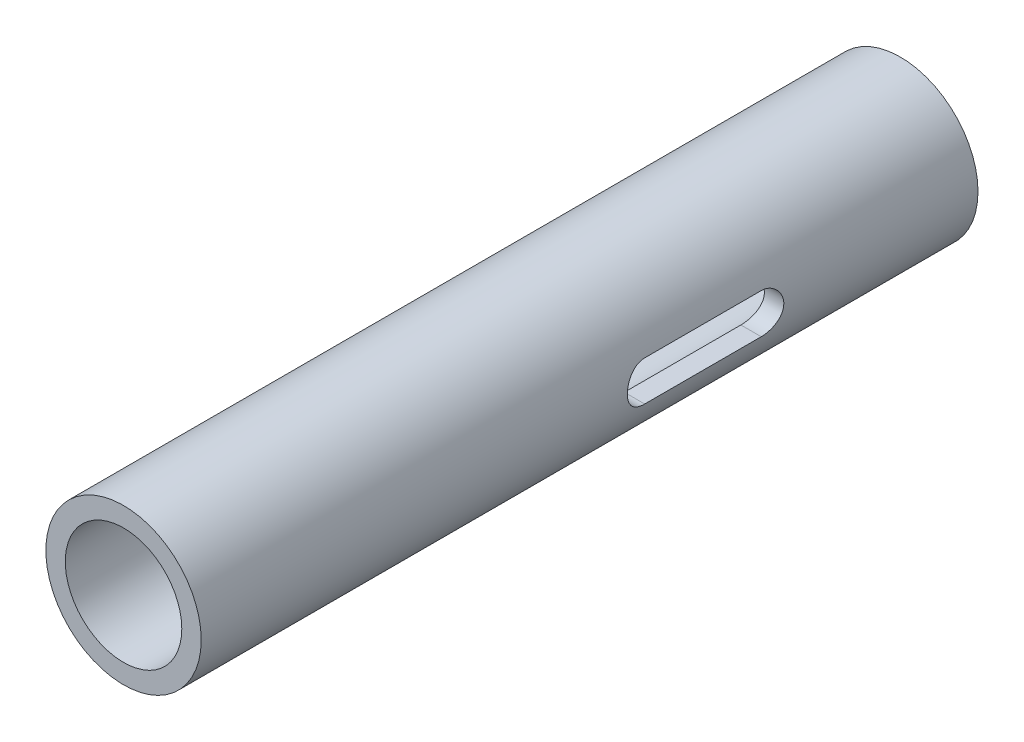
ISO-10303-21;
HEADER;
FILE_DESCRIPTION(('STEP AP214'),'2;1');
FILE_NAME('part.step','',(''),(''),'','','');
FILE_SCHEMA(('AUTOMOTIVE_DESIGN { 1 0 10303 214 1 1 1 1 }'));
ENDSEC;
DATA;
#1=APPLICATION_CONTEXT('core data for automotive mechanical design processes');
#2=APPLICATION_PROTOCOL_DEFINITION('international standard','automotive_design',2000,#1);
#3=PRODUCT_CONTEXT('',#1,'mechanical');
#4=PRODUCT('Part','Part','',(#3));
#5=PRODUCT_RELATED_PRODUCT_CATEGORY('part','',(#4));
#6=PRODUCT_DEFINITION_FORMATION('','',#4);
#7=PRODUCT_DEFINITION_CONTEXT('part definition',#1,'design');
#8=PRODUCT_DEFINITION('design','',#6,#7);
#9=PRODUCT_DEFINITION_SHAPE('','',#8);
#10=(LENGTH_UNIT() NAMED_UNIT(*) SI_UNIT(.MILLI.,.METRE.));
#11=(NAMED_UNIT(*) PLANE_ANGLE_UNIT() SI_UNIT($,.RADIAN.));
#12=(NAMED_UNIT(*) SI_UNIT($,.STERADIAN.) SOLID_ANGLE_UNIT());
#13=UNCERTAINTY_MEASURE_WITH_UNIT(LENGTH_MEASURE(1.E-05),#10,'distance_accuracy_value','');
#14=(GEOMETRIC_REPRESENTATION_CONTEXT(3) GLOBAL_UNCERTAINTY_ASSIGNED_CONTEXT((#13)) GLOBAL_UNIT_ASSIGNED_CONTEXT((#10,
#11,#12)) REPRESENTATION_CONTEXT('',''));
#15=CARTESIAN_POINT('',(0.,0.,0.));
#16=DIRECTION('',(0.,0.,1.));
#17=DIRECTION('',(1.,0.,0.));
#18=AXIS2_PLACEMENT_3D('',#15,#16,#17);
#19=CARTESIAN_POINT('',(0.,0.,127.));
#20=DIRECTION('',(0.,0.,1.));
#21=DIRECTION('',(1.,0.,0.));
#22=AXIS2_PLACEMENT_3D('',#19,#20,#21);
#23=PLANE('',#22);
#24=CARTESIAN_POINT('',(0.,0.,127.));
#25=DIRECTION('',(0.,0.,1.));
#26=DIRECTION('',(1.,0.,0.));
#27=AXIS2_PLACEMENT_3D('',#24,#25,#26);
#28=CIRCLE('',#27,12.7);
#29=CARTESIAN_POINT('',(12.7,0.,127.));
#30=VERTEX_POINT('',#29);
#31=EDGE_CURVE('E117',#30,#30,#28,.T.);
#32=ORIENTED_EDGE('',*,*,#31,.T.);
#33=EDGE_LOOP('',(#32));
#34=FACE_BOUND('',#33,.T.);
#35=CARTESIAN_POINT('',(0.,0.,127.));
#36=DIRECTION('',(0.,0.,1.));
#37=DIRECTION('',(1.,0.,0.));
#38=AXIS2_PLACEMENT_3D('',#35,#36,#37);
#39=CIRCLE('',#38,9.525);
#40=CARTESIAN_POINT('',(9.525,0.,127.));
#41=VERTEX_POINT('',#40);
#42=EDGE_CURVE('E253',#41,#41,#39,.T.);
#43=ORIENTED_EDGE('',*,*,#42,.F.);
#44=EDGE_LOOP('',(#43));
#45=FACE_BOUND('',#44,.T.);
#46=ADVANCED_FACE('F37',(#34,#45),#23,.T.);
#47=CARTESIAN_POINT('',(0.,0.,0.));
#48=DIRECTION('',(0.,0.,1.));
#49=DIRECTION('',(1.,0.,0.));
#50=AXIS2_PLACEMENT_3D('',#47,#48,#49);
#51=PLANE('',#50);
#52=CARTESIAN_POINT('',(0.,0.,0.));
#53=DIRECTION('',(0.,0.,1.));
#54=DIRECTION('',(1.,0.,0.));
#55=AXIS2_PLACEMENT_3D('',#52,#53,#54);
#56=CIRCLE('',#55,12.7);
#57=CARTESIAN_POINT('',(12.7,0.,0.));
#58=VERTEX_POINT('',#57);
#59=EDGE_CURVE('E254',#58,#58,#56,.T.);
#60=ORIENTED_EDGE('',*,*,#59,.F.);
#61=EDGE_LOOP('',(#60));
#62=FACE_BOUND('',#61,.T.);
#63=CARTESIAN_POINT('',(0.,0.,0.));
#64=DIRECTION('',(0.,0.,1.));
#65=DIRECTION('',(1.,0.,0.));
#66=AXIS2_PLACEMENT_3D('',#63,#64,#65);
#67=CIRCLE('',#66,9.525);
#68=CARTESIAN_POINT('',(9.525,0.,0.));
#69=VERTEX_POINT('',#68);
#70=EDGE_CURVE('E255',#69,#69,#67,.T.);
#71=ORIENTED_EDGE('',*,*,#70,.T.);
#72=EDGE_LOOP('',(#71));
#73=FACE_BOUND('',#72,.T.);
#74=ADVANCED_FACE('F242',(#62,#73),#51,.F.);
#75=CARTESIAN_POINT('',(0.,0.,127.));
#76=DIRECTION('',(0.,0.,-1.));
#77=DIRECTION('',(-1.,0.,0.));
#78=AXIS2_PLACEMENT_3D('',#75,#76,#77);
#79=CYLINDRICAL_SURFACE('',#78,12.7);
#80=DIRECTION('',(0.,0.,-1.));
#81=VECTOR('',#80,1.);
#82=CARTESIAN_POINT('',(-12.2734248190959,3.26389999999993,127.));
#83=LINE('',#82,#81);
#84=CARTESIAN_POINT('',(-12.2734248190959,3.26390000000001,35.0139));
#85=VERTEX_POINT('',#84);
#86=CARTESIAN_POINT('',(-12.2734248190959,3.26389999999993,54.0639));
#87=VERTEX_POINT('',#86);
#88=EDGE_CURVE('E227',#85,#87,#83,.F.);
#89=ORIENTED_EDGE('',*,*,#88,.T.);
#90=CARTESIAN_POINT('',(-12.2734248190959,3.26389999999999,54.0639));
#91=CARTESIAN_POINT('',(-12.2734144108259,3.26391055053027,54.1540754120549));
#92=CARTESIAN_POINT('',(-12.2744183915703,3.26016309974644,54.2442444999871));
#93=CARTESIAN_POINT('',(-12.2783779162481,3.24523415800526,54.4239066499794));
#94=CARTESIAN_POINT('',(-12.2813331178063,3.23405397124699,54.5133998278535));
#95=CARTESIAN_POINT('',(-12.289109951055,3.2043718807396,54.6908969987009));
#96=CARTESIAN_POINT('',(-12.2939277493891,3.185885012926,54.7789036652743));
#97=CARTESIAN_POINT('',(-12.305277051545,3.14176250936818,54.9529691740793));
#98=CARTESIAN_POINT('',(-12.3118085816124,3.11612676413864,55.0390279864577));
#99=CARTESIAN_POINT('',(-12.3336990910444,3.02878178792379,55.2933631953533));
#100=CARTESIAN_POINT('',(-12.3513626650057,2.95660369718546,55.4579827186057));
#101=CARTESIAN_POINT('',(-12.3908278251596,2.78656700545897,55.7727454400238));
#102=CARTESIAN_POINT('',(-12.4126306267119,2.68870085870911,55.9228843668235));
#103=CARTESIAN_POINT('',(-12.4584819865657,2.46763132382919,56.2079674843945));
#104=CARTESIAN_POINT('',(-12.482567854957,2.34394276751898,56.3425301699907));
#105=CARTESIAN_POINT('',(-12.5299499201814,2.07578058840762,56.5892492535216));
#106=CARTESIAN_POINT('',(-12.5532459895084,1.93130362905842,56.7014020477431));
#107=CARTESIAN_POINT('',(-12.5968390361188,1.62302152315224,56.9017018223921));
#108=CARTESIAN_POINT('',(-12.6170865472263,1.45896206016138,56.9894691223791));
#109=CARTESIAN_POINT('',(-12.6518707583606,1.11781824067082,57.136028446436));
#110=CARTESIAN_POINT('',(-12.6664086267609,0.940736557743771,57.1948263991779));
#111=CARTESIAN_POINT('',(-12.6878716118127,0.582578577194606,57.2805479121931));
#112=CARTESIAN_POINT('',(-12.6949525740035,0.401668183223409,57.3081249372417));
#113=CARTESIAN_POINT('',(-12.7012478248137,0.0376555116864279,57.3326749502054));
#114=CARTESIAN_POINT('',(-12.7004631669341,-0.145446469062703,57.3296520365975));
#115=CARTESIAN_POINT('',(-12.6912305374075,-0.504097711038503,57.2935527215432));
#116=CARTESIAN_POINT('',(-12.682962668166,-0.679723399837958,57.2611826041996));
#117=CARTESIAN_POINT('',(-12.6599035967458,-1.02295962518231,57.1684459682812));
#118=CARTESIAN_POINT('',(-12.6451120969493,-1.19056979566052,57.1080781724039));
#119=CARTESIAN_POINT('',(-12.6103954894228,-1.51485797082376,56.9604992447361));
#120=CARTESIAN_POINT('',(-12.5904232761546,-1.67141794868385,56.8730402905194));
#121=CARTESIAN_POINT('',(-12.5475064116433,-1.96788020248808,56.6739553888824));
#122=CARTESIAN_POINT('',(-12.5245612827935,-2.10777979495186,56.5623255564087));
#123=CARTESIAN_POINT('',(-12.4774217745919,-2.37115521872035,56.3142994536534));
#124=CARTESIAN_POINT('',(-12.4532104267039,-2.49405021632795,56.1772886729856));
#125=CARTESIAN_POINT('',(-12.4068561069003,-2.71527718463148,55.8843492603424));
#126=CARTESIAN_POINT('',(-12.3847137041454,-2.81360240863788,55.7284154496588));
#127=CARTESIAN_POINT('',(-12.3449342605158,-2.98333751963892,55.4006610577978));
#128=CARTESIAN_POINT('',(-12.3273245867442,-3.05458509691482,55.2287521294401));
#129=CARTESIAN_POINT('',(-12.3060402480571,-3.13881804246227,54.963620742792));
#130=CARTESIAN_POINT('',(-12.2998010713866,-3.16312059150831,54.8740468424806));
#131=CARTESIAN_POINT('',(-12.289209305548,-3.20402701768614,54.6930599972177));
#132=CARTESIAN_POINT('',(-12.284855834516,-3.22063449372865,54.6016479328724));
#133=CARTESIAN_POINT('',(-12.2788363454474,-3.24349979902598,54.4358076561568));
#134=CARTESIAN_POINT('',(-12.2768099027939,-3.25115179431757,54.3615802619453));
#135=CARTESIAN_POINT('',(-12.2741030100413,-3.26134966177462,54.212871304739));
#136=CARTESIAN_POINT('',(-12.2734204009922,-3.26390372416932,54.1383903423136));
#137=CARTESIAN_POINT('',(-12.2734248190959,-3.26389999999999,54.0639));
#138=B_SPLINE_CURVE_WITH_KNOTS('',3,(#90,#91,#92,#93,#94,#95,#96,#97,#98,#99,#100,#101,#102,
#103,#104,#105,#106,#107,#108,#109,#110,#111,#112,#113,#114,#115,#116,#117,#118,#119,#120,#121,
#122,#123,#124,#125,#126,#127,#128,#129,#130,#131,#132,#133,#134,#135,#136,#137),.UNSPECIFIED.,
.F.,.F.,(4,2,2,2,2,2,2,2,2,2,2,2,2,2,2,2,2,2,2,2,2,2,2,4),(0.,0.270431925586068,
0.540816411842303,0.810647364775644,1.08048245040672,1.61959818945736,2.15887246912907,
2.7093761916241,3.25996836897668,3.81870585380654,4.37732894362744,4.92403022592184,
5.47065828542677,6.00447031550631,6.53830670140926,7.07717836833245,7.61613671400137,
8.17043599672096,8.7248873193355,9.28261161356196,9.56138667175923,9.84003121764646,
10.0637970484861,10.2872030916675),.UNSPECIFIED.);
#139=CARTESIAN_POINT('',(-12.2734248190959,-3.26389999999999,54.0639));
#140=VERTEX_POINT('',#139);
#141=EDGE_CURVE('E123',#87,#140,#138,.T.);
#142=ORIENTED_EDGE('',*,*,#141,.T.);
#143=DIRECTION('',(0.,0.,-1.));
#144=VECTOR('',#143,1.);
#145=CARTESIAN_POINT('',(-12.2734248190959,-3.26389999999999,127.));
#146=LINE('',#145,#144);
#147=CARTESIAN_POINT('',(-12.2734248190959,-3.2639,35.0139));
#148=VERTEX_POINT('',#147);
#149=EDGE_CURVE('E181',#140,#148,#146,.T.);
#150=ORIENTED_EDGE('',*,*,#149,.T.);
#151=CARTESIAN_POINT('',(-12.2734248190959,-3.26390000000001,35.0139));
#152=CARTESIAN_POINT('',(-12.2734144108259,-3.26391055053029,34.9237245879451));
#153=CARTESIAN_POINT('',(-12.2744183915703,-3.26016309974646,34.8335555000129));
#154=CARTESIAN_POINT('',(-12.2783779162481,-3.24523415800527,34.6538933500207));
#155=CARTESIAN_POINT('',(-12.2813331178062,-3.234053971247,34.5644001721465));
#156=CARTESIAN_POINT('',(-12.289109951055,-3.20437188073962,34.3869030012991));
#157=CARTESIAN_POINT('',(-12.2939277493891,-3.18588501292602,34.2988963347257));
#158=CARTESIAN_POINT('',(-12.305277051545,-3.1417625093682,34.1248308259207));
#159=CARTESIAN_POINT('',(-12.3118085816124,-3.11612676413866,34.0387720135422));
#160=CARTESIAN_POINT('',(-12.3336990910444,-3.02878178792381,33.7844368046467));
#161=CARTESIAN_POINT('',(-12.3513626650057,-2.95660369718547,33.6198172813943));
#162=CARTESIAN_POINT('',(-12.3908278251596,-2.78656700545898,33.3050545599762));
#163=CARTESIAN_POINT('',(-12.4126306267119,-2.68870085870913,33.1549156331765));
#164=CARTESIAN_POINT('',(-12.4584819865657,-2.46763132382921,32.8698325156055));
#165=CARTESIAN_POINT('',(-12.482567854957,-2.343942767519,32.7352698300093));
#166=CARTESIAN_POINT('',(-12.5299499201814,-2.07578058840764,32.4885507464784));
#167=CARTESIAN_POINT('',(-12.5532459895084,-1.93130362905844,32.3763979522569));
#168=CARTESIAN_POINT('',(-12.5968390361188,-1.62302152315226,32.1760981776079));
#169=CARTESIAN_POINT('',(-12.6170865472263,-1.45896206016139,32.0883308776209));
#170=CARTESIAN_POINT('',(-12.6518707583606,-1.11781824067084,31.941771553564));
#171=CARTESIAN_POINT('',(-12.6664086267609,-0.940736557743785,31.882973600822));
#172=CARTESIAN_POINT('',(-12.6878716118127,-0.582578577194621,31.7972520878068));
#173=CARTESIAN_POINT('',(-12.6949525740035,-0.401668183223424,31.7696750627583));
#174=CARTESIAN_POINT('',(-12.7012478248137,-0.0376555116864424,31.7451250497945));
#175=CARTESIAN_POINT('',(-12.7004631669341,0.145446469062689,31.7481479634025));
#176=CARTESIAN_POINT('',(-12.6912305374075,0.504097711038493,31.7842472784568));
#177=CARTESIAN_POINT('',(-12.682962668166,0.679723399837949,31.8166173958004));
#178=CARTESIAN_POINT('',(-12.6599035967458,1.0229596251823,31.9093540317188));
#179=CARTESIAN_POINT('',(-12.6451120969493,1.19056979566051,31.9697218275961));
#180=CARTESIAN_POINT('',(-12.6103954894228,1.51485797082376,32.1173007552639));
#181=CARTESIAN_POINT('',(-12.5904232761546,1.67141794868384,32.2047597094806));
#182=CARTESIAN_POINT('',(-12.5475064116433,1.96788020248807,32.4038446111176));
#183=CARTESIAN_POINT('',(-12.5245612827935,2.10777979495185,32.5154744435913));
#184=CARTESIAN_POINT('',(-12.477421774592,2.37115521872035,32.7635005463466));
#185=CARTESIAN_POINT('',(-12.4532104267039,2.49405021632795,32.9005113270144));
#186=CARTESIAN_POINT('',(-12.4068561069003,2.71527718463148,33.1934507396575));
#187=CARTESIAN_POINT('',(-12.3847137041454,2.81360240863788,33.3493845503412));
#188=CARTESIAN_POINT('',(-12.3449342605158,2.98333751963892,33.6771389422022));
#189=CARTESIAN_POINT('',(-12.3273245867442,3.05458509691482,33.8490478705599));
#190=CARTESIAN_POINT('',(-12.3060402480571,3.13881804246226,34.114179257208));
#191=CARTESIAN_POINT('',(-12.2998010713866,3.1631205915083,34.2037531575194));
#192=CARTESIAN_POINT('',(-12.289209305548,3.20402701768614,34.3847400027823));
#193=CARTESIAN_POINT('',(-12.284855834516,3.22063449372865,34.4761520671276));
#194=CARTESIAN_POINT('',(-12.2788363454474,3.24349979902598,34.6419923438432));
#195=CARTESIAN_POINT('',(-12.2768099027939,3.25115179431757,34.7162197380547));
#196=CARTESIAN_POINT('',(-12.2741030100413,3.26134966177462,34.864928695261));
#197=CARTESIAN_POINT('',(-12.2734204009922,3.26390372416932,34.9394096576864));
#198=CARTESIAN_POINT('',(-12.2734248190959,3.2639,35.0139));
#199=B_SPLINE_CURVE_WITH_KNOTS('',3,(#151,#152,#153,#154,#155,#156,#157,#158,#159,#160,#161,
#162,#163,#164,#165,#166,#167,#168,#169,#170,#171,#172,#173,#174,#175,#176,#177,#178,#179,#180,
#181,#182,#183,#184,#185,#186,#187,#188,#189,#190,#191,#192,#193,#194,#195,#196,#197,#198),
.UNSPECIFIED.,.F.,.F.,(4,2,2,2,2,2,2,2,2,2,2,2,2,2,2,2,2,2,2,2,2,2,2,4),(0.,0.270431925586062,
0.540816411842303,0.810647364775644,1.08048245040672,1.61959818945736,2.15887246912907,
2.7093761916241,3.25996836897668,3.81870585380655,4.37732894362745,4.92403022592185,
5.47065828542678,6.00447031550633,6.53830670140928,7.07717836833246,7.61613671400139,
8.17043599672098,8.72488731933553,9.28261161356198,9.56138667175925,9.84003121764649,
10.0637970484861,10.2872030916676),.UNSPECIFIED.);
#200=EDGE_CURVE('E184',#148,#85,#199,.T.);
#201=ORIENTED_EDGE('',*,*,#200,.T.);
#202=EDGE_LOOP('',(#89,#142,#150,#201));
#203=FACE_BOUND('',#202,.T.);
#204=DIRECTION('',(0.,0.,-1.));
#205=VECTOR('',#204,1.);
#206=CARTESIAN_POINT('',(12.2734248190959,-3.26389999999999,127.));
#207=LINE('',#206,#205);
#208=CARTESIAN_POINT('',(12.2734248190959,-3.2639,35.0139));
#209=VERTEX_POINT('',#208);
#210=CARTESIAN_POINT('',(12.2734248190959,-3.26389999999999,54.0639));
#211=VERTEX_POINT('',#210);
#212=EDGE_CURVE('E178',#209,#211,#207,.F.);
#213=ORIENTED_EDGE('',*,*,#212,.T.);
#214=CARTESIAN_POINT('',(12.2734248190959,-3.26389999999999,54.0639));
#215=CARTESIAN_POINT('',(12.2734144108259,-3.26391055053028,54.1540754120549));
#216=CARTESIAN_POINT('',(12.2744183915703,-3.26016309974644,54.2442444999871));
#217=CARTESIAN_POINT('',(12.2783779162481,-3.24523415800526,54.4239066499794));
#218=CARTESIAN_POINT('',(12.2813331178063,-3.23405397124699,54.5133998278535));
#219=CARTESIAN_POINT('',(12.289109951055,-3.20437188073961,54.6908969987009));
#220=CARTESIAN_POINT('',(12.2939277493891,-3.185885012926,54.7789036652743));
#221=CARTESIAN_POINT('',(12.305277051545,-3.14176250936818,54.9529691740793));
#222=CARTESIAN_POINT('',(12.3118085816124,-3.11612676413865,55.0390279864577));
#223=CARTESIAN_POINT('',(12.3336990910444,-3.02878178792379,55.2933631953533));
#224=CARTESIAN_POINT('',(12.3513626650057,-2.95660369718546,55.4579827186057));
#225=CARTESIAN_POINT('',(12.3908278251596,-2.78656700545897,55.7727454400238));
#226=CARTESIAN_POINT('',(12.4126306267119,-2.68870085870912,55.9228843668235));
#227=CARTESIAN_POINT('',(12.4584819865657,-2.4676313238292,56.2079674843945));
#228=CARTESIAN_POINT('',(12.482567854957,-2.34394276751898,56.3425301699907));
#229=CARTESIAN_POINT('',(12.5299499201814,-2.07578058840762,56.5892492535216));
#230=CARTESIAN_POINT('',(12.5532459895084,-1.93130362905843,56.7014020477431));
#231=CARTESIAN_POINT('',(12.5968390361188,-1.62302152315225,56.9017018223921));
#232=CARTESIAN_POINT('',(12.6170865472263,-1.45896206016138,56.9894691223791));
#233=CARTESIAN_POINT('',(12.6518707583606,-1.11781824067083,57.136028446436));
#234=CARTESIAN_POINT('',(12.6664086267609,-0.940736557743774,57.1948263991779));
#235=CARTESIAN_POINT('',(12.6878716118127,-0.582578577194609,57.2805479121931));
#236=CARTESIAN_POINT('',(12.6949525740035,-0.401668183223412,57.3081249372417));
#237=CARTESIAN_POINT('',(12.7012478248137,-0.0376555116864308,57.3326749502054));
#238=CARTESIAN_POINT('',(12.7004631669341,0.1454464690627,57.3296520365975));
#239=CARTESIAN_POINT('',(12.6912305374075,0.504097711038501,57.2935527215432));
#240=CARTESIAN_POINT('',(12.682962668166,0.679723399837956,57.2611826041996));
#241=CARTESIAN_POINT('',(12.6599035967458,1.02295962518231,57.1684459682812));
#242=CARTESIAN_POINT('',(12.6451120969493,1.19056979566052,57.1080781724039));
#243=CARTESIAN_POINT('',(12.6103954894228,1.51485797082376,56.9604992447361));
#244=CARTESIAN_POINT('',(12.5904232761546,1.67141794868384,56.8730402905194));
#245=CARTESIAN_POINT('',(12.5475064116433,1.96788020248808,56.6739553888824));
#246=CARTESIAN_POINT('',(12.5245612827935,2.10777979495186,56.5623255564087));
#247=CARTESIAN_POINT('',(12.4774217745919,2.37115521872035,56.3142994536534));
#248=CARTESIAN_POINT('',(12.4532104267039,2.49405021632796,56.1772886729856));
#249=CARTESIAN_POINT('',(12.4068561069003,2.71527718463148,55.8843492603424));
#250=CARTESIAN_POINT('',(12.3847137041454,2.81360240863788,55.7284154496588));
#251=CARTESIAN_POINT('',(12.3449342605158,2.98333751963892,55.4006610577978));
#252=CARTESIAN_POINT('',(12.3273245867442,3.05458509691482,55.2287521294401));
#253=CARTESIAN_POINT('',(12.3060402480571,3.13881804246226,54.963620742792));
#254=CARTESIAN_POINT('',(12.2998010713866,3.1631205915083,54.8740468424806));
#255=CARTESIAN_POINT('',(12.289209305548,3.20402701768614,54.6930599972177));
#256=CARTESIAN_POINT('',(12.284855834516,3.22063449372865,54.6016479328724));
#257=CARTESIAN_POINT('',(12.2788363454474,3.24349979902598,54.4358076561568));
#258=CARTESIAN_POINT('',(12.2768099027939,3.25115179431756,54.3615802619453));
#259=CARTESIAN_POINT('',(12.2741030100413,3.26134966177461,54.212871304739));
#260=CARTESIAN_POINT('',(12.2734204009922,3.26390372416932,54.1383903423136));
#261=CARTESIAN_POINT('',(12.2734248190959,3.26389999999999,54.0639));
#262=B_SPLINE_CURVE_WITH_KNOTS('',3,(#214,#215,#216,#217,#218,#219,#220,#221,#222,#223,#224,
#225,#226,#227,#228,#229,#230,#231,#232,#233,#234,#235,#236,#237,#238,#239,#240,#241,#242,#243,
#244,#245,#246,#247,#248,#249,#250,#251,#252,#253,#254,#255,#256,#257,#258,#259,#260,#261),
.UNSPECIFIED.,.F.,.F.,(4,2,2,2,2,2,2,2,2,2,2,2,2,2,2,2,2,2,2,2,2,2,2,4),(0.,0.270431925586062,
0.540816411842303,0.810647364775644,1.08048245040672,1.61959818945736,2.15887246912907,
2.7093761916241,3.25996836897668,3.81870585380654,4.37732894362744,4.92403022592184,
5.47065828542678,6.00447031550631,6.53830670140926,7.07717836833245,7.61613671400137,
8.17043599672097,8.7248873193355,9.28261161356196,9.56138667175923,9.84003121764646,
10.0637970484861,10.2872030916675),.UNSPECIFIED.);
#263=CARTESIAN_POINT('',(12.2734248190959,3.26389999999999,54.0639));
#264=VERTEX_POINT('',#263);
#265=EDGE_CURVE('E170',#211,#264,#262,.T.);
#266=ORIENTED_EDGE('',*,*,#265,.T.);
#267=DIRECTION('',(0.,0.,-1.));
#268=VECTOR('',#267,1.);
#269=CARTESIAN_POINT('',(12.2734248190959,3.26389999999993,127.));
#270=LINE('',#269,#268);
#271=CARTESIAN_POINT('',(12.2734248190959,3.26389999999993,35.0139));
#272=VERTEX_POINT('',#271);
#273=EDGE_CURVE('E171',#264,#272,#270,.T.);
#274=ORIENTED_EDGE('',*,*,#273,.T.);
#275=CARTESIAN_POINT('',(12.2734248190959,3.2639,35.0139));
#276=CARTESIAN_POINT('',(12.2734144108259,3.26391055053028,34.9237245879451));
#277=CARTESIAN_POINT('',(12.2744183915703,3.26016309974644,34.8335555000129));
#278=CARTESIAN_POINT('',(12.2783779162481,3.24523415800526,34.6538933500207));
#279=CARTESIAN_POINT('',(12.2813331178063,3.23405397124699,34.5644001721465));
#280=CARTESIAN_POINT('',(12.289109951055,3.20437188073961,34.3869030012991));
#281=CARTESIAN_POINT('',(12.2939277493891,3.18588501292601,34.2988963347257));
#282=CARTESIAN_POINT('',(12.305277051545,3.14176250936818,34.1248308259207));
#283=CARTESIAN_POINT('',(12.3118085816124,3.11612676413865,34.0387720135422));
#284=CARTESIAN_POINT('',(12.3336990910444,3.0287817879238,33.7844368046467));
#285=CARTESIAN_POINT('',(12.3513626650057,2.95660369718546,33.6198172813943));
#286=CARTESIAN_POINT('',(12.3908278251596,2.78656700545898,33.3050545599762));
#287=CARTESIAN_POINT('',(12.4126306267119,2.68870085870912,33.1549156331765));
#288=CARTESIAN_POINT('',(12.4584819865657,2.4676313238292,32.8698325156055));
#289=CARTESIAN_POINT('',(12.482567854957,2.34394276751899,32.7352698300093));
#290=CARTESIAN_POINT('',(12.5299499201814,2.07578058840763,32.4885507464784));
#291=CARTESIAN_POINT('',(12.5532459895084,1.93130362905843,32.3763979522569));
#292=CARTESIAN_POINT('',(12.5968390361188,1.62302152315225,32.1760981776079));
#293=CARTESIAN_POINT('',(12.6170865472263,1.45896206016138,32.0883308776209));
#294=CARTESIAN_POINT('',(12.6518707583606,1.11781824067083,31.941771553564));
#295=CARTESIAN_POINT('',(12.6664086267609,0.940736557743775,31.882973600822));
#296=CARTESIAN_POINT('',(12.6878716118127,0.582578577194611,31.7972520878068));
#297=CARTESIAN_POINT('',(12.6949525740035,0.401668183223414,31.7696750627583));
#298=CARTESIAN_POINT('',(12.7012478248137,0.0376555116864321,31.7451250497945));
#299=CARTESIAN_POINT('',(12.7004631669341,-0.1454464690627,31.7481479634025));
#300=CARTESIAN_POINT('',(12.6912305374075,-0.504097711038503,31.7842472784568));
#301=CARTESIAN_POINT('',(12.682962668166,-0.67972339983796,31.8166173958004));
#302=CARTESIAN_POINT('',(12.6599035967458,-1.02295962518231,31.9093540317188));
#303=CARTESIAN_POINT('',(12.6451120969493,-1.19056979566052,31.9697218275961));
#304=CARTESIAN_POINT('',(12.6103954894228,-1.51485797082377,32.1173007552639));
#305=CARTESIAN_POINT('',(12.5904232761546,-1.67141794868385,32.2047597094806));
#306=CARTESIAN_POINT('',(12.5475064116433,-1.96788020248808,32.4038446111176));
#307=CARTESIAN_POINT('',(12.5245612827935,-2.10777979495186,32.5154744435913));
#308=CARTESIAN_POINT('',(12.4774217745919,-2.37115521872036,32.7635005463466));
#309=CARTESIAN_POINT('',(12.4532104267039,-2.49405021632796,32.9005113270144));
#310=CARTESIAN_POINT('',(12.4068561069003,-2.71527718463149,33.1934507396575));
#311=CARTESIAN_POINT('',(12.3847137041454,-2.81360240863789,33.3493845503412));
#312=CARTESIAN_POINT('',(12.3449342605158,-2.98333751963893,33.6771389422022));
#313=CARTESIAN_POINT('',(12.3273245867442,-3.05458509691483,33.8490478705599));
#314=CARTESIAN_POINT('',(12.3060402480571,-3.13881804246228,34.114179257208));
#315=CARTESIAN_POINT('',(12.2998010713866,-3.16312059150831,34.2037531575194));
#316=CARTESIAN_POINT('',(12.289209305548,-3.20402701768615,34.3847400027823));
#317=CARTESIAN_POINT('',(12.284855834516,-3.22063449372866,34.4761520671276));
#318=CARTESIAN_POINT('',(12.2788363454474,-3.24349979902599,34.6419923438432));
#319=CARTESIAN_POINT('',(12.2768099027939,-3.25115179431758,34.7162197380547));
#320=CARTESIAN_POINT('',(12.2741030100413,-3.26134966177463,34.864928695261));
#321=CARTESIAN_POINT('',(12.2734204009922,-3.26390372416933,34.9394096576864));
#322=CARTESIAN_POINT('',(12.2734248190959,-3.26390000000001,35.0139));
#323=B_SPLINE_CURVE_WITH_KNOTS('',3,(#275,#276,#277,#278,#279,#280,#281,#282,#283,#284,#285,
#286,#287,#288,#289,#290,#291,#292,#293,#294,#295,#296,#297,#298,#299,#300,#301,#302,#303,#304,
#305,#306,#307,#308,#309,#310,#311,#312,#313,#314,#315,#316,#317,#318,#319,#320,#321,#322),
.UNSPECIFIED.,.F.,.F.,(4,2,2,2,2,2,2,2,2,2,2,2,2,2,2,2,2,2,2,2,2,2,2,4),(0.,0.270431925586062,
0.540816411842303,0.810647364775644,1.08048245040672,1.61959818945735,2.15887246912906,
2.7093761916241,3.25996836897668,3.81870585380655,4.37732894362745,4.92403022592185,
5.47065828542678,6.00447031550633,6.53830670140927,7.07717836833246,7.61613671400138,
8.17043599672098,8.72488731933553,9.28261161356198,9.56138667175925,9.84003121764649,
10.0637970484861,10.2872030916676),.UNSPECIFIED.);
#324=EDGE_CURVE('E190',#272,#209,#323,.T.);
#325=ORIENTED_EDGE('',*,*,#324,.T.);
#326=EDGE_LOOP('',(#213,#266,#274,#325));
#327=FACE_BOUND('',#326,.T.);
#328=ORIENTED_EDGE('',*,*,#31,.F.);
#329=EDGE_LOOP('',(#328));
#330=FACE_BOUND('',#329,.T.);
#331=ORIENTED_EDGE('',*,*,#59,.T.);
#332=EDGE_LOOP('',(#331));
#333=FACE_BOUND('',#332,.T.);
#334=ADVANCED_FACE('F39',(#203,#327,#330,#333),#79,.T.);
#335=CARTESIAN_POINT('',(0.,0.,127.));
#336=DIRECTION('',(0.,0.,-1.));
#337=DIRECTION('',(-1.,0.,0.));
#338=AXIS2_PLACEMENT_3D('',#335,#336,#337);
#339=CYLINDRICAL_SURFACE('',#338,9.525);
#340=CARTESIAN_POINT('',(8.94832843552359,3.2639,35.0139));
#341=CARTESIAN_POINT('',(8.94831372899892,3.26391190436705,34.9250105762208));
#342=CARTESIAN_POINT('',(8.94965258210811,3.26026903079203,34.8361293285898));
#343=CARTESIAN_POINT('',(8.95492788311255,3.24576650409378,34.6590596774531));
#344=CARTESIAN_POINT('',(8.95886359397914,3.23490889861758,34.5708710845454));
#345=CARTESIAN_POINT('',(8.96920725314198,3.20611398452491,34.3960815565169));
#346=CARTESIAN_POINT('',(8.97560755233225,3.18819857660436,34.3094765691408));
#347=CARTESIAN_POINT('',(8.99066905477269,3.14547372969521,34.1382069929815));
#348=CARTESIAN_POINT('',(8.99933034667456,3.12066402038416,34.0535424804242));
#349=CARTESIAN_POINT('',(9.0283170528592,3.03623083619243,33.8034346686453));
#350=CARTESIAN_POINT('',(9.05166252906384,2.96655823820172,33.6416069612291));
#351=CARTESIAN_POINT('',(9.10374961061478,2.80262801129911,33.3319070410225));
#352=CARTESIAN_POINT('',(9.13249476354924,2.7083542034511,33.1840440996118));
#353=CARTESIAN_POINT('',(9.19346589412871,2.49373007480575,32.9003395146336));
#354=CARTESIAN_POINT('',(9.22578178653016,2.37253722342166,32.7651532439994));
#355=CARTESIAN_POINT('',(9.28949607062229,2.10931349784267,32.5165760697641));
#356=CARTESIAN_POINT('',(9.3208942952604,1.96727885758706,32.403189113819));
#357=CARTESIAN_POINT('',(9.38028830347705,1.66153436613817,32.1983864383201));
#358=CARTESIAN_POINT('',(9.40816542154267,1.49733221798693,32.1076681156375));
#359=CARTESIAN_POINT('',(9.4563051700778,1.15488371343928,31.9554086292752));
#360=CARTESIAN_POINT('',(9.47657023534152,0.976641869890241,31.893858134312));
#361=CARTESIAN_POINT('',(9.5065636106305,0.618091577523781,31.8039303652144));
#362=CARTESIAN_POINT('',(9.51665040963598,0.43809751542468,31.7744214334147));
#363=CARTESIAN_POINT('',(9.52642638367541,0.0754453371596008,31.7458101582939));
#364=CARTESIAN_POINT('',(9.5261181892376,-0.107212093327014,31.7467001223133));
#365=CARTESIAN_POINT('',(9.51537824361667,-0.461968510617578,31.7781573600216));
#366=CARTESIAN_POINT('',(9.50536634971039,-0.634191453203286,31.8074938410099));
#367=CARTESIAN_POINT('',(9.47687634951377,-0.971100455569425,31.8929677984564));
#368=CARTESIAN_POINT('',(9.4583977693695,-1.13578609294299,31.9491067749738));
#369=CARTESIAN_POINT('',(9.41452910256879,-1.45557197870509,32.0872792117082));
#370=CARTESIAN_POINT('',(9.38904895853756,-1.61051254826087,32.1696524714161));
#371=CARTESIAN_POINT('',(9.33381408193562,-1.90472565043708,32.357668162288));
#372=CARTESIAN_POINT('',(9.30405813283871,-2.04399370383144,32.463317220318));
#373=CARTESIAN_POINT('',(9.24165466304684,-2.31020910643065,32.7010309618516));
#374=CARTESIAN_POINT('',(9.20893691873215,-2.43620550331771,32.8341442519201));
#375=CARTESIAN_POINT('',(9.1455205287556,-2.66442111241129,33.1198637809741));
#376=CARTESIAN_POINT('',(9.11482256285813,-2.76663234869141,33.2724765322555));
#377=CARTESIAN_POINT('',(9.05851114982036,-2.94584925279095,33.5962519116511));
#378=CARTESIAN_POINT('',(9.03298887752794,-3.02241625189364,33.7676766696029));
#379=CARTESIAN_POINT('',(9.00147910568077,-3.1144861480287,34.0331726186905));
#380=CARTESIAN_POINT('',(8.99210587206237,-3.14137653867215,34.1230473766049));
#381=CARTESIAN_POINT('',(8.97590987844964,-3.18736030114681,34.3049829940755));
#382=CARTESIAN_POINT('',(8.96908595711976,-3.20645722364848,34.3970428378414));
#383=CARTESIAN_POINT('',(8.95860218294747,-3.23563075922415,34.5763780834459));
#384=CARTESIAN_POINT('',(8.95476042205611,-3.24622758102499,34.6635589397732));
#385=CARTESIAN_POINT('',(8.94961827230748,-3.26036320693562,34.8384567636348));
#386=CARTESIAN_POINT('',(8.94831477196298,-3.26391065252316,34.9261729424012));
#387=CARTESIAN_POINT('',(8.94832843552359,-3.26390000000001,35.0139));
#388=B_SPLINE_CURVE_WITH_KNOTS('',3,(#340,#341,#342,#343,#344,#345,#346,#347,#348,#349,#350,
#351,#352,#353,#354,#355,#356,#357,#358,#359,#360,#361,#362,#363,#364,#365,#366,#367,#368,#369,
#370,#371,#372,#373,#374,#375,#376,#377,#378,#379,#380,#381,#382,#383,#384,#385,#386,#387),
.UNSPECIFIED.,.F.,.F.,(4,2,2,2,2,2,2,2,2,2,2,2,2,2,2,2,2,2,2,2,2,2,2,4),(0.,0.266569787740287,
0.533063951350233,0.798737603399754,1.0644216738641,1.59497693283558,2.12588199361009,
2.67661878259319,3.22745521120762,3.79358475643085,4.35953306472185,4.90476828947099,
5.44986553953992,5.97238428075492,6.49493226928178,7.02454441501399,7.55430754224011,
8.11029061464942,8.66645985819623,9.23170755026659,9.51422911865658,9.79662182735586,
10.0600253796317,10.3231058389879),.UNSPECIFIED.);
#389=CARTESIAN_POINT('',(8.94832843552361,3.26390000000001,35.0139));
#390=VERTEX_POINT('',#389);
#391=CARTESIAN_POINT('',(8.94832843552359,-3.2639,35.0139));
#392=VERTEX_POINT('',#391);
#393=EDGE_CURVE('E11',#390,#392,#388,.T.);
#394=ORIENTED_EDGE('',*,*,#393,.F.);
#395=DIRECTION('',(0.,0.,-1.));
#396=VECTOR('',#395,1.);
#397=CARTESIAN_POINT('',(8.94832843552361,3.26389999999993,127.));
#398=LINE('',#397,#396);
#399=CARTESIAN_POINT('',(8.94832843552361,3.26389999999993,54.0639));
#400=VERTEX_POINT('',#399);
#401=EDGE_CURVE('E208',#400,#390,#398,.T.);
#402=ORIENTED_EDGE('',*,*,#401,.F.);
#403=CARTESIAN_POINT('',(8.94832843552359,-3.26389999999999,54.0639));
#404=CARTESIAN_POINT('',(8.94831372899892,-3.26391190436704,54.1527894237792));
#405=CARTESIAN_POINT('',(8.94965258210811,-3.26026903079203,54.2416706714102));
#406=CARTESIAN_POINT('',(8.95492788311255,-3.24576650409378,54.4187403225469));
#407=CARTESIAN_POINT('',(8.95886359397914,-3.23490889861758,54.5069289154546));
#408=CARTESIAN_POINT('',(8.96920725314198,-3.20611398452491,54.6817184434831));
#409=CARTESIAN_POINT('',(8.97560755233225,-3.18819857660435,54.7683234308592));
#410=CARTESIAN_POINT('',(8.99066905477269,-3.14547372969521,54.9395930070185));
#411=CARTESIAN_POINT('',(8.99933034667457,-3.12066402038415,55.0242575195758));
#412=CARTESIAN_POINT('',(9.0283170528592,-3.03623083619243,55.2743653313547));
#413=CARTESIAN_POINT('',(9.05166252906384,-2.96655823820171,55.4361930387709));
#414=CARTESIAN_POINT('',(9.10374961061478,-2.80262801129911,55.7458929589775));
#415=CARTESIAN_POINT('',(9.13249476354924,-2.7083542034511,55.8937559003882));
#416=CARTESIAN_POINT('',(9.19346589412871,-2.49373007480575,56.1774604853664));
#417=CARTESIAN_POINT('',(9.22578178653017,-2.37253722342165,56.3126467560006));
#418=CARTESIAN_POINT('',(9.28949607062229,-2.10931349784266,56.5612239302358));
#419=CARTESIAN_POINT('',(9.32089429526041,-1.96727885758705,56.674610886181));
#420=CARTESIAN_POINT('',(9.38028830347706,-1.66153436613817,56.8794135616799));
#421=CARTESIAN_POINT('',(9.40816542154267,-1.49733221798693,56.9701318843625));
#422=CARTESIAN_POINT('',(9.4563051700778,-1.15488371343928,57.1223913707247));
#423=CARTESIAN_POINT('',(9.47657023534152,-0.97664186989024,57.183941865688));
#424=CARTESIAN_POINT('',(9.5065636106305,-0.618091577523781,57.2738696347856));
#425=CARTESIAN_POINT('',(9.51665040963598,-0.438097515424681,57.3033785665853));
#426=CARTESIAN_POINT('',(9.52642638367541,-0.0754453371596042,57.3319898417061));
#427=CARTESIAN_POINT('',(9.5261181892376,0.10721209332701,57.3310998776867));
#428=CARTESIAN_POINT('',(9.51537824361667,0.461968510617573,57.2996426399783));
#429=CARTESIAN_POINT('',(9.50536634971039,0.634191453203282,57.2703061589901));
#430=CARTESIAN_POINT('',(9.47687634951377,0.97110045556942,57.1848322015436));
#431=CARTESIAN_POINT('',(9.4583977693695,1.13578609294298,57.1286932250262));
#432=CARTESIAN_POINT('',(9.41452910256879,1.45557197870508,56.9905207882918));
#433=CARTESIAN_POINT('',(9.38904895853756,1.61051254826086,56.9081475285839));
#434=CARTESIAN_POINT('',(9.33381408193563,1.90472565043706,56.720131837712));
#435=CARTESIAN_POINT('',(9.30405813283871,2.04399370383143,56.614482779682));
#436=CARTESIAN_POINT('',(9.24165466304684,2.31020910643064,56.3767690381484));
#437=CARTESIAN_POINT('',(9.20893691873215,2.4362055033177,56.2436557480799));
#438=CARTESIAN_POINT('',(9.1455205287556,2.66442111241128,55.9579362190259));
#439=CARTESIAN_POINT('',(9.11482256285814,2.76663234869139,55.8053234677445));
#440=CARTESIAN_POINT('',(9.05851114982037,2.94584925279093,55.4815480883489));
#441=CARTESIAN_POINT('',(9.03298887752794,3.02241625189363,55.3101233303971));
#442=CARTESIAN_POINT('',(9.00147910568077,3.11448614802869,55.0446273813095));
#443=CARTESIAN_POINT('',(8.99210587206237,3.14137653867214,54.9547526233951));
#444=CARTESIAN_POINT('',(8.97590987844965,3.1873603011468,54.7728170059245));
#445=CARTESIAN_POINT('',(8.96908595711976,3.20645722364847,54.6807571621586));
#446=CARTESIAN_POINT('',(8.95860218294747,3.23563075922414,54.5014219165541));
#447=CARTESIAN_POINT('',(8.95476042205612,3.24622758102497,54.4142410602268));
#448=CARTESIAN_POINT('',(8.94961827230749,3.26036320693561,54.2393432363652));
#449=CARTESIAN_POINT('',(8.94831477196299,3.26391065252315,54.1516270575988));
#450=CARTESIAN_POINT('',(8.94832843552359,3.26389999999999,54.0639));
#451=B_SPLINE_CURVE_WITH_KNOTS('',3,(#403,#404,#405,#406,#407,#408,#409,#410,#411,#412,#413,
#414,#415,#416,#417,#418,#419,#420,#421,#422,#423,#424,#425,#426,#427,#428,#429,#430,#431,#432,
#433,#434,#435,#436,#437,#438,#439,#440,#441,#442,#443,#444,#445,#446,#447,#448,#449,#450),
.UNSPECIFIED.,.F.,.F.,(4,2,2,2,2,2,2,2,2,2,2,2,2,2,2,2,2,2,2,2,2,2,2,4),(0.,0.266569787740287,
0.533063951350233,0.798737603399754,1.0644216738641,1.59497693283558,2.12588199361009,
2.6766187825932,3.22745521120762,3.79358475643084,4.35953306472184,4.90476828947098,
5.44986553953991,5.97238428075491,6.49493226928177,7.02454441501397,7.55430754224009,
8.1102906146494,8.66645985819621,9.23170755026657,9.51422911865657,9.79662182735584,
10.0600253796316,10.3231058389878),.UNSPECIFIED.);
#452=CARTESIAN_POINT('',(8.94832843552359,-3.26389999999999,54.0639));
#453=VERTEX_POINT('',#452);
#454=EDGE_CURVE('E158',#453,#400,#451,.T.);
#455=ORIENTED_EDGE('',*,*,#454,.F.);
#456=DIRECTION('',(0.,0.,-1.));
#457=VECTOR('',#456,1.);
#458=CARTESIAN_POINT('',(8.94832843552359,-3.26389999999999,127.));
#459=LINE('',#458,#457);
#460=EDGE_CURVE('E52',#392,#453,#459,.F.);
#461=ORIENTED_EDGE('',*,*,#460,.F.);
#462=EDGE_LOOP('',(#394,#402,#455,#461));
#463=FACE_BOUND('',#462,.T.);
#464=CARTESIAN_POINT('',(-8.94832843552359,-3.26390000000001,35.0139));
#465=CARTESIAN_POINT('',(-8.94831372899892,-3.26391190436706,34.9250105762208));
#466=CARTESIAN_POINT('',(-8.94965258210811,-3.26026903079204,34.8361293285898));
#467=CARTESIAN_POINT('',(-8.95492788311254,-3.24576650409379,34.6590596774531));
#468=CARTESIAN_POINT('',(-8.95886359397913,-3.23490889861759,34.5708710845454));
#469=CARTESIAN_POINT('',(-8.96920725314198,-3.20611398452492,34.3960815565169));
#470=CARTESIAN_POINT('',(-8.97560755233224,-3.18819857660437,34.3094765691408));
#471=CARTESIAN_POINT('',(-8.99066905477268,-3.14547372969522,34.1382069929815));
#472=CARTESIAN_POINT('',(-8.99933034667456,-3.12066402038417,34.0535424804242));
#473=CARTESIAN_POINT('',(-9.02831705285919,-3.03623083619244,33.8034346686453));
#474=CARTESIAN_POINT('',(-9.05166252906384,-2.96655823820173,33.6416069612291));
#475=CARTESIAN_POINT('',(-9.10374961061477,-2.80262801129912,33.3319070410225));
#476=CARTESIAN_POINT('',(-9.13249476354924,-2.70835420345111,33.1840440996118));
#477=CARTESIAN_POINT('',(-9.1934658941287,-2.49373007480576,32.9003395146336));
#478=CARTESIAN_POINT('',(-9.22578178653016,-2.37253722342167,32.7651532439994));
#479=CARTESIAN_POINT('',(-9.28949607062229,-2.10931349784268,32.5165760697641));
#480=CARTESIAN_POINT('',(-9.3208942952604,-1.96727885758707,32.403189113819));
#481=CARTESIAN_POINT('',(-9.38028830347705,-1.66153436613818,32.1983864383201));
#482=CARTESIAN_POINT('',(-9.40816542154267,-1.49733221798694,32.1076681156375));
#483=CARTESIAN_POINT('',(-9.4563051700778,-1.1548837134393,31.9554086292752));
#484=CARTESIAN_POINT('',(-9.47657023534152,-0.976641869890251,31.893858134312));
#485=CARTESIAN_POINT('',(-9.5065636106305,-0.618091577523791,31.8039303652144));
#486=CARTESIAN_POINT('',(-9.51665040963598,-0.438097515424689,31.7744214334147));
#487=CARTESIAN_POINT('',(-9.52642638367541,-0.0754453371596097,31.7458101582939));
#488=CARTESIAN_POINT('',(-9.5261181892376,0.107212093327005,31.7467001223133));
#489=CARTESIAN_POINT('',(-9.51537824361667,0.461968510617569,31.7781573600216));
#490=CARTESIAN_POINT('',(-9.50536634971039,0.634191453203277,31.8074938410099));
#491=CARTESIAN_POINT('',(-9.47687634951377,0.971100455569415,31.8929677984564));
#492=CARTESIAN_POINT('',(-9.4583977693695,1.13578609294298,31.9491067749738));
#493=CARTESIAN_POINT('',(-9.41452910256879,1.45557197870508,32.0872792117082));
#494=CARTESIAN_POINT('',(-9.38904895853756,1.61051254826085,32.1696524714161));
#495=CARTESIAN_POINT('',(-9.33381408193562,1.90472565043706,32.3576681622879));
#496=CARTESIAN_POINT('',(-9.30405813283871,2.04399370383143,32.463317220318));
#497=CARTESIAN_POINT('',(-9.24165466304684,2.31020910643064,32.7010309618516));
#498=CARTESIAN_POINT('',(-9.20893691873215,2.4362055033177,32.8341442519201));
#499=CARTESIAN_POINT('',(-9.1455205287556,2.66442111241128,33.1198637809741));
#500=CARTESIAN_POINT('',(-9.11482256285814,2.7666323486914,33.2724765322555));
#501=CARTESIAN_POINT('',(-9.05851114982036,2.94584925279094,33.5962519116511));
#502=CARTESIAN_POINT('',(-9.03298887752794,3.02241625189363,33.7676766696029));
#503=CARTESIAN_POINT('',(-9.00147910568077,3.11448614802869,34.0331726186905));
#504=CARTESIAN_POINT('',(-8.99210587206237,3.14137653867214,34.1230473766049));
#505=CARTESIAN_POINT('',(-8.97590987844965,3.1873603011468,34.3049829940755));
#506=CARTESIAN_POINT('',(-8.96908595711976,3.20645722364847,34.3970428378414));
#507=CARTESIAN_POINT('',(-8.95860218294747,3.23563075922414,34.5763780834459));
#508=CARTESIAN_POINT('',(-8.95476042205611,3.24622758102498,34.6635589397732));
#509=CARTESIAN_POINT('',(-8.94961827230748,3.26036320693561,34.8384567636348));
#510=CARTESIAN_POINT('',(-8.94831477196299,3.26391065252315,34.9261729424012));
#511=CARTESIAN_POINT('',(-8.94832843552359,3.2639,35.0139));
#512=B_SPLINE_CURVE_WITH_KNOTS('',3,(#464,#465,#466,#467,#468,#469,#470,#471,#472,#473,#474,
#475,#476,#477,#478,#479,#480,#481,#482,#483,#484,#485,#486,#487,#488,#489,#490,#491,#492,#493,
#494,#495,#496,#497,#498,#499,#500,#501,#502,#503,#504,#505,#506,#507,#508,#509,#510,#511),
.UNSPECIFIED.,.F.,.F.,(4,2,2,2,2,2,2,2,2,2,2,2,2,2,2,2,2,2,2,2,2,2,2,4),(0.,0.266569787740287,
0.533063951350233,0.798737603399747,1.0644216738641,1.59497693283558,2.12588199361009,
2.67661878259319,3.22745521120762,3.79358475643085,4.35953306472185,4.90476828947099,
5.44986553953992,5.97238428075492,6.49493226928178,7.02454441501399,7.55430754224011,
8.11029061464942,8.66645985819623,9.23170755026658,9.51422911865658,9.79662182735586,
10.0600253796317,10.3231058389879),.UNSPECIFIED.);
#513=CARTESIAN_POINT('',(-8.94832843552359,-3.2639,35.0139));
#514=VERTEX_POINT('',#513);
#515=CARTESIAN_POINT('',(-8.94832843552361,3.26389999999993,35.0139));
#516=VERTEX_POINT('',#515);
#517=EDGE_CURVE('E133',#514,#516,#512,.T.);
#518=ORIENTED_EDGE('',*,*,#517,.F.);
#519=DIRECTION('',(0.,0.,-1.));
#520=VECTOR('',#519,1.);
#521=CARTESIAN_POINT('',(-8.94832843552359,-3.26389999999999,127.));
#522=LINE('',#521,#520);
#523=CARTESIAN_POINT('',(-8.94832843552359,-3.26389999999999,54.0639));
#524=VERTEX_POINT('',#523);
#525=EDGE_CURVE('E131',#524,#514,#522,.T.);
#526=ORIENTED_EDGE('',*,*,#525,.F.);
#527=CARTESIAN_POINT('',(-8.94832843552359,3.26389999999999,54.0639));
#528=CARTESIAN_POINT('',(-8.94831372899892,3.26391190436704,54.1527894237792));
#529=CARTESIAN_POINT('',(-8.94965258210812,3.26026903079202,54.2416706714102));
#530=CARTESIAN_POINT('',(-8.95492788311255,3.24576650409378,54.4187403225469));
#531=CARTESIAN_POINT('',(-8.95886359397914,3.23490889861757,54.5069289154546));
#532=CARTESIAN_POINT('',(-8.96920725314198,3.20611398452491,54.6817184434831));
#533=CARTESIAN_POINT('',(-8.97560755233225,3.18819857660435,54.7683234308592));
#534=CARTESIAN_POINT('',(-8.99066905477269,3.1454737296952,54.9395930070185));
#535=CARTESIAN_POINT('',(-8.99933034667457,3.12066402038415,55.0242575195758));
#536=CARTESIAN_POINT('',(-9.0283170528592,3.03623083619242,55.2743653313547));
#537=CARTESIAN_POINT('',(-9.05166252906385,2.96655823820171,55.4361930387709));
#538=CARTESIAN_POINT('',(-9.10374961061478,2.8026280112991,55.7458929589775));
#539=CARTESIAN_POINT('',(-9.13249476354924,2.7083542034511,55.8937559003882));
#540=CARTESIAN_POINT('',(-9.19346589412871,2.49373007480574,56.1774604853664));
#541=CARTESIAN_POINT('',(-9.22578178653017,2.37253722342165,56.3126467560006));
#542=CARTESIAN_POINT('',(-9.28949607062229,2.10931349784266,56.5612239302358));
#543=CARTESIAN_POINT('',(-9.32089429526041,1.96727885758705,56.674610886181));
#544=CARTESIAN_POINT('',(-9.38028830347706,1.66153436613816,56.8794135616799));
#545=CARTESIAN_POINT('',(-9.40816542154267,1.49733221798692,56.9701318843625));
#546=CARTESIAN_POINT('',(-9.4563051700778,1.15488371343928,57.1223913707247));
#547=CARTESIAN_POINT('',(-9.47657023534152,0.976641869890236,57.183941865688));
#548=CARTESIAN_POINT('',(-9.5065636106305,0.618091577523778,57.2738696347856));
#549=CARTESIAN_POINT('',(-9.51665040963598,0.438097515424678,57.3033785665853));
#550=CARTESIAN_POINT('',(-9.52642638367541,0.075445337159601,57.3319898417061));
#551=CARTESIAN_POINT('',(-9.5261181892376,-0.107212093327013,57.3310998776867));
#552=CARTESIAN_POINT('',(-9.51537824361667,-0.461968510617576,57.2996426399783));
#553=CARTESIAN_POINT('',(-9.50536634971039,-0.634191453203285,57.2703061589901));
#554=CARTESIAN_POINT('',(-9.47687634951377,-0.971100455569423,57.1848322015436));
#555=CARTESIAN_POINT('',(-9.4583977693695,-1.13578609294299,57.1286932250262));
#556=CARTESIAN_POINT('',(-9.41452910256879,-1.45557197870509,56.9905207882918));
#557=CARTESIAN_POINT('',(-9.38904895853756,-1.61051254826086,56.9081475285839));
#558=CARTESIAN_POINT('',(-9.33381408193563,-1.90472565043707,56.720131837712));
#559=CARTESIAN_POINT('',(-9.30405813283871,-2.04399370383143,56.614482779682));
#560=CARTESIAN_POINT('',(-9.24165466304684,-2.31020910643064,56.3767690381484));
#561=CARTESIAN_POINT('',(-9.20893691873215,-2.4362055033177,56.2436557480799));
#562=CARTESIAN_POINT('',(-9.1455205287556,-2.66442111241128,55.9579362190259));
#563=CARTESIAN_POINT('',(-9.11482256285814,-2.7666323486914,55.8053234677445));
#564=CARTESIAN_POINT('',(-9.05851114982036,-2.94584925279094,55.4815480883489));
#565=CARTESIAN_POINT('',(-9.03298887752794,-3.02241625189363,55.3101233303971));
#566=CARTESIAN_POINT('',(-9.00147910568077,-3.11448614802869,55.0446273813095));
#567=CARTESIAN_POINT('',(-8.99210587206237,-3.14137653867214,54.9547526233951));
#568=CARTESIAN_POINT('',(-8.97590987844965,-3.1873603011468,54.7728170059245));
#569=CARTESIAN_POINT('',(-8.96908595711976,-3.20645722364847,54.6807571621586));
#570=CARTESIAN_POINT('',(-8.95860218294747,-3.23563075922414,54.5014219165541));
#571=CARTESIAN_POINT('',(-8.95476042205612,-3.24622758102498,54.4142410602268));
#572=CARTESIAN_POINT('',(-8.94961827230749,-3.26036320693561,54.2393432363652));
#573=CARTESIAN_POINT('',(-8.94831477196299,-3.26391065252315,54.1516270575988));
#574=CARTESIAN_POINT('',(-8.94832843552359,-3.26389999999999,54.0639));
#575=B_SPLINE_CURVE_WITH_KNOTS('',3,(#527,#528,#529,#530,#531,#532,#533,#534,#535,#536,#537,
#538,#539,#540,#541,#542,#543,#544,#545,#546,#547,#548,#549,#550,#551,#552,#553,#554,#555,#556,
#557,#558,#559,#560,#561,#562,#563,#564,#565,#566,#567,#568,#569,#570,#571,#572,#573,#574),
.UNSPECIFIED.,.F.,.F.,(4,2,2,2,2,2,2,2,2,2,2,2,2,2,2,2,2,2,2,2,2,2,2,4),(0.,0.266569787740287,
0.533063951350233,0.798737603399754,1.0644216738641,1.59497693283558,2.12588199361009,
2.6766187825932,3.22745521120762,3.79358475643084,4.35953306472184,4.90476828947098,
5.44986553953991,5.97238428075491,6.49493226928176,7.02454441501398,7.55430754224009,
8.1102906146494,8.66645985819621,9.23170755026657,9.51422911865656,9.79662182735583,
10.0600253796316,10.3231058389878),.UNSPECIFIED.);
#576=CARTESIAN_POINT('',(-8.94832843552361,3.26389999999999,54.0639));
#577=VERTEX_POINT('',#576);
#578=EDGE_CURVE('E116',#577,#524,#575,.T.);
#579=ORIENTED_EDGE('',*,*,#578,.F.);
#580=DIRECTION('',(0.,0.,-1.));
#581=VECTOR('',#580,1.);
#582=CARTESIAN_POINT('',(-8.94832843552361,3.26389999999993,127.));
#583=LINE('',#582,#581);
#584=EDGE_CURVE('E108',#516,#577,#583,.F.);
#585=ORIENTED_EDGE('',*,*,#584,.F.);
#586=EDGE_LOOP('',(#518,#526,#579,#585));
#587=FACE_BOUND('',#586,.T.);
#588=ORIENTED_EDGE('',*,*,#42,.T.);
#589=EDGE_LOOP('',(#588));
#590=FACE_BOUND('',#589,.T.);
#591=ORIENTED_EDGE('',*,*,#70,.F.);
#592=EDGE_LOOP('',(#591));
#593=FACE_BOUND('',#592,.T.);
#594=ADVANCED_FACE('F129',(#463,#587,#590,#593),#339,.F.);
#595=CARTESIAN_POINT('',(-12.7,3.26390000000001,35.0139));
#596=DIRECTION('',(0.,1.,0.));
#597=DIRECTION('',(0.,0.,1.));
#598=AXIS2_PLACEMENT_3D('',#595,#596,#597);
#599=PLANE('',#598);
#600=DIRECTION('',(1.,0.,0.));
#601=VECTOR('',#600,1.);
#602=CARTESIAN_POINT('',(-12.7,3.26390000000001,35.0139));
#603=LINE('',#602,#601);
#604=EDGE_CURVE('E111',#85,#516,#603,.T.);
#605=ORIENTED_EDGE('',*,*,#604,.T.);
#606=ORIENTED_EDGE('',*,*,#584,.T.);
#607=DIRECTION('',(1.,0.,0.));
#608=VECTOR('',#607,1.);
#609=CARTESIAN_POINT('',(-12.7,3.26389999999999,54.0639));
#610=LINE('',#609,#608);
#611=EDGE_CURVE('E59',#87,#577,#610,.T.);
#612=ORIENTED_EDGE('',*,*,#611,.F.);
#613=ORIENTED_EDGE('',*,*,#88,.F.);
#614=EDGE_LOOP('',(#605,#606,#612,#613));
#615=FACE_BOUND('',#614,.T.);
#616=ADVANCED_FACE('F109',(#615),#599,.F.);
#617=CARTESIAN_POINT('',(-12.7,0.,54.0639));
#618=DIRECTION('',(1.,0.,0.));
#619=DIRECTION('',(0.,0.,-1.));
#620=AXIS2_PLACEMENT_3D('',#617,#618,#619);
#621=CYLINDRICAL_SURFACE('',#620,3.26389999999999);
#622=ORIENTED_EDGE('',*,*,#611,.T.);
#623=ORIENTED_EDGE('',*,*,#578,.T.);
#624=DIRECTION('',(1.,0.,0.));
#625=VECTOR('',#624,1.);
#626=CARTESIAN_POINT('',(-12.7,-3.26389999999999,54.0639));
#627=LINE('',#626,#625);
#628=EDGE_CURVE('E223',#140,#524,#627,.T.);
#629=ORIENTED_EDGE('',*,*,#628,.F.);
#630=ORIENTED_EDGE('',*,*,#141,.F.);
#631=EDGE_LOOP('',(#622,#623,#629,#630));
#632=FACE_BOUND('',#631,.T.);
#633=ADVANCED_FACE('F120',(#632),#621,.F.);
#634=CARTESIAN_POINT('',(-12.7,-3.2639,35.0139));
#635=DIRECTION('',(0.,-1.,0.));
#636=DIRECTION('',(0.,0.,-1.));
#637=AXIS2_PLACEMENT_3D('',#634,#635,#636);
#638=PLANE('',#637);
#639=ORIENTED_EDGE('',*,*,#628,.T.);
#640=ORIENTED_EDGE('',*,*,#525,.T.);
#641=DIRECTION('',(1.,0.,0.));
#642=VECTOR('',#641,1.);
#643=CARTESIAN_POINT('',(-12.7,-3.2639,35.0139));
#644=LINE('',#643,#642);
#645=EDGE_CURVE('E228',#148,#514,#644,.T.);
#646=ORIENTED_EDGE('',*,*,#645,.F.);
#647=ORIENTED_EDGE('',*,*,#149,.F.);
#648=EDGE_LOOP('',(#639,#640,#646,#647));
#649=FACE_BOUND('',#648,.T.);
#650=ADVANCED_FACE('F152',(#649),#638,.F.);
#651=CARTESIAN_POINT('',(-12.7,0.,35.0139));
#652=DIRECTION('',(1.,0.,0.));
#653=DIRECTION('',(0.,0.,-1.));
#654=AXIS2_PLACEMENT_3D('',#651,#652,#653);
#655=CYLINDRICAL_SURFACE('',#654,3.2639);
#656=ORIENTED_EDGE('',*,*,#645,.T.);
#657=ORIENTED_EDGE('',*,*,#517,.T.);
#658=ORIENTED_EDGE('',*,*,#604,.F.);
#659=ORIENTED_EDGE('',*,*,#200,.F.);
#660=EDGE_LOOP('',(#656,#657,#658,#659));
#661=FACE_BOUND('',#660,.T.);
#662=ADVANCED_FACE('F199',(#661),#655,.F.);
#663=EDGE_CURVE('E67',#390,#272,#603,.T.);
#664=ORIENTED_EDGE('',*,*,#663,.F.);
#665=ORIENTED_EDGE('',*,*,#393,.T.);
#666=EDGE_CURVE('E220',#392,#209,#644,.T.);
#667=ORIENTED_EDGE('',*,*,#666,.T.);
#668=ORIENTED_EDGE('',*,*,#324,.F.);
#669=EDGE_LOOP('',(#664,#665,#667,#668));
#670=FACE_BOUND('',#669,.T.);
#671=ADVANCED_FACE('F196',(#670),#655,.F.);
#672=ORIENTED_EDGE('',*,*,#666,.F.);
#673=ORIENTED_EDGE('',*,*,#460,.T.);
#674=EDGE_CURVE('E125',#453,#211,#627,.T.);
#675=ORIENTED_EDGE('',*,*,#674,.T.);
#676=ORIENTED_EDGE('',*,*,#212,.F.);
#677=EDGE_LOOP('',(#672,#673,#675,#676));
#678=FACE_BOUND('',#677,.T.);
#679=ADVANCED_FACE('F150',(#678),#638,.F.);
#680=ORIENTED_EDGE('',*,*,#674,.F.);
#681=ORIENTED_EDGE('',*,*,#454,.T.);
#682=EDGE_CURVE('E126',#400,#264,#610,.T.);
#683=ORIENTED_EDGE('',*,*,#682,.T.);
#684=ORIENTED_EDGE('',*,*,#265,.F.);
#685=EDGE_LOOP('',(#680,#681,#683,#684));
#686=FACE_BOUND('',#685,.T.);
#687=ADVANCED_FACE('F144',(#686),#621,.F.);
#688=ORIENTED_EDGE('',*,*,#682,.F.);
#689=ORIENTED_EDGE('',*,*,#401,.T.);
#690=ORIENTED_EDGE('',*,*,#663,.T.);
#691=ORIENTED_EDGE('',*,*,#273,.F.);
#692=EDGE_LOOP('',(#688,#689,#690,#691));
#693=FACE_BOUND('',#692,.T.);
#694=ADVANCED_FACE('F149',(#693),#599,.F.);
#695=CLOSED_SHELL('',(#46,#74,#334,#594,#616,#633,#650,#662,#671,#679,#687,#694));
#696=MANIFOLD_SOLID_BREP('B2',#695);
#697=ADVANCED_BREP_SHAPE_REPRESENTATION('',(#18,#696),#14);
#698=SHAPE_DEFINITION_REPRESENTATION(#9,#697);
ENDSEC;
END-ISO-10303-21;
